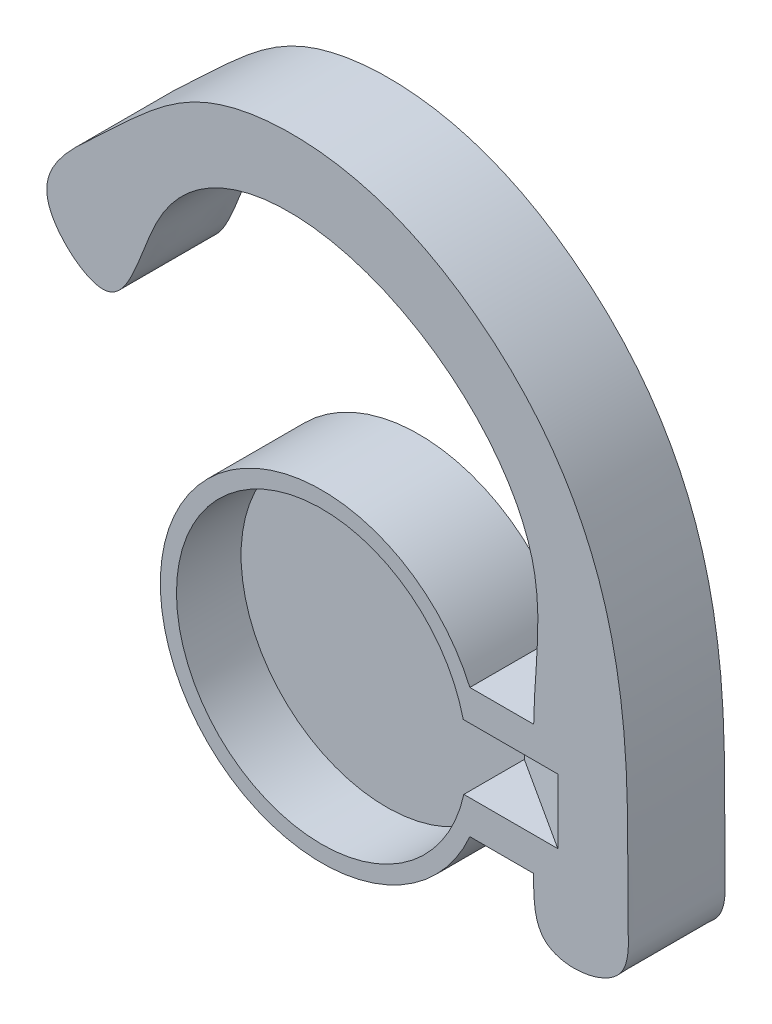
ISO-10303-21;
HEADER;
FILE_DESCRIPTION(('STEP AP214'),'2;1');
FILE_NAME('part.step','',(''),(''),'','','');
FILE_SCHEMA(('AUTOMOTIVE_DESIGN { 1 0 10303 214 1 1 1 1 }'));
ENDSEC;
DATA;
#1=APPLICATION_CONTEXT('core data for automotive mechanical design processes');
#2=APPLICATION_PROTOCOL_DEFINITION('international standard','automotive_design',2000,#1);
#3=PRODUCT_CONTEXT('',#1,'mechanical');
#4=PRODUCT('Part','Part','',(#3));
#5=PRODUCT_RELATED_PRODUCT_CATEGORY('part','',(#4));
#6=PRODUCT_DEFINITION_FORMATION('','',#4);
#7=PRODUCT_DEFINITION_CONTEXT('part definition',#1,'design');
#8=PRODUCT_DEFINITION('design','',#6,#7);
#9=PRODUCT_DEFINITION_SHAPE('','',#8);
#10=(LENGTH_UNIT() NAMED_UNIT(*) SI_UNIT(.MILLI.,.METRE.));
#11=(NAMED_UNIT(*) PLANE_ANGLE_UNIT() SI_UNIT($,.RADIAN.));
#12=(NAMED_UNIT(*) SI_UNIT($,.STERADIAN.) SOLID_ANGLE_UNIT());
#13=UNCERTAINTY_MEASURE_WITH_UNIT(LENGTH_MEASURE(1.E-05),#10,'distance_accuracy_value','');
#14=(GEOMETRIC_REPRESENTATION_CONTEXT(3) GLOBAL_UNCERTAINTY_ASSIGNED_CONTEXT((#13)) GLOBAL_UNIT_ASSIGNED_CONTEXT((#10,
#11,#12)) REPRESENTATION_CONTEXT('',''));
#15=CARTESIAN_POINT('',(0.,0.,0.));
#16=DIRECTION('',(0.,0.,1.));
#17=DIRECTION('',(1.,0.,0.));
#18=AXIS2_PLACEMENT_3D('',#15,#16,#17);
#19=CARTESIAN_POINT('',(0.,0.,9.525));
#20=DIRECTION('',(0.,0.,-1.));
#21=DIRECTION('',(-1.,0.,0.));
#22=AXIS2_PLACEMENT_3D('',#19,#20,#21);
#23=CYLINDRICAL_SURFACE('',#22,15.875);
#24=CARTESIAN_POINT('',(0.,0.,0.));
#25=DIRECTION('',(0.,0.,1.));
#26=DIRECTION('',(1.,0.,0.));
#27=AXIS2_PLACEMENT_3D('',#24,#25,#26);
#28=CIRCLE('',#27,15.875);
#29=CARTESIAN_POINT('',(14.5496777974352,6.35000007801745,0.));
#30=VERTEX_POINT('',#29);
#31=CARTESIAN_POINT('',(14.5496778314848,-6.35,0.));
#32=VERTEX_POINT('',#31);
#33=EDGE_CURVE('E132',#30,#32,#28,.T.);
#34=ORIENTED_EDGE('',*,*,#33,.T.);
#35=DIRECTION('',(0.,0.,-1.));
#36=VECTOR('',#35,1.);
#37=CARTESIAN_POINT('',(14.5496778314848,-6.35,9.525));
#38=LINE('',#37,#36);
#39=CARTESIAN_POINT('',(14.5496778314848,-6.35,9.525));
#40=VERTEX_POINT('',#39);
#41=EDGE_CURVE('E11',#40,#32,#38,.T.);
#42=ORIENTED_EDGE('',*,*,#41,.F.);
#43=CARTESIAN_POINT('',(0.,0.,9.525));
#44=DIRECTION('',(0.,0.,1.));
#45=DIRECTION('',(1.,0.,0.));
#46=AXIS2_PLACEMENT_3D('',#43,#44,#45);
#47=CIRCLE('',#46,15.875);
#48=CARTESIAN_POINT('',(14.5496777974352,6.35000007801745,9.525));
#49=VERTEX_POINT('',#48);
#50=EDGE_CURVE('E134',#49,#40,#47,.T.);
#51=ORIENTED_EDGE('',*,*,#50,.F.);
#52=DIRECTION('',(0.,0.,-1.));
#53=VECTOR('',#52,1.);
#54=CARTESIAN_POINT('',(14.5496777974352,6.35000007801745,9.525));
#55=LINE('',#54,#53);
#56=EDGE_CURVE('E180',#49,#30,#55,.T.);
#57=ORIENTED_EDGE('',*,*,#56,.T.);
#58=EDGE_LOOP('',(#34,#42,#51,#57));
#59=FACE_BOUND('',#58,.T.);
#60=ADVANCED_FACE('F37',(#59),#23,.T.);
#61=CARTESIAN_POINT('',(14.5496778314848,-6.35,9.525));
#62=DIRECTION('',(1.82651203069688E-08,1.,0.));
#63=DIRECTION('',(-1.,1.82651203069688E-08,0.));
#64=AXIS2_PLACEMENT_3D('',#61,#62,#63);
#65=PLANE('',#64);
#66=DIRECTION('',(1.,-1.82651203069688E-08,0.));
#67=VECTOR('',#66,1.);
#68=CARTESIAN_POINT('',(14.5496778314848,-6.35,0.));
#69=LINE('',#68,#67);
#70=CARTESIAN_POINT('',(20.8252672601889,-6.3500001146244,0.));
#71=VERTEX_POINT('',#70);
#72=EDGE_CURVE('E159',#32,#71,#69,.T.);
#73=ORIENTED_EDGE('',*,*,#72,.T.);
#74=DIRECTION('',(0.,0.,-1.));
#75=VECTOR('',#74,1.);
#76=CARTESIAN_POINT('',(20.8252672601889,-6.3500001146244,9.525));
#77=LINE('',#76,#75);
#78=CARTESIAN_POINT('',(20.8252672601889,-6.3500001146244,9.525));
#79=VERTEX_POINT('',#78);
#80=EDGE_CURVE('E44',#79,#71,#77,.T.);
#81=ORIENTED_EDGE('',*,*,#80,.F.);
#82=DIRECTION('',(1.,-1.82651203069688E-08,0.));
#83=VECTOR('',#82,1.);
#84=CARTESIAN_POINT('',(14.5496778314848,-6.35,9.525));
#85=LINE('',#84,#83);
#86=EDGE_CURVE('E88',#40,#79,#85,.T.);
#87=ORIENTED_EDGE('',*,*,#86,.F.);
#88=ORIENTED_EDGE('',*,*,#41,.T.);
#89=EDGE_LOOP('',(#73,#81,#87,#88));
#90=FACE_BOUND('',#89,.T.);
#91=ADVANCED_FACE('F151',(#90),#65,.F.);
#92=CARTESIAN_POINT('',(20.8252672601889,-6.3500001146244,9.525));
#93=CARTESIAN_POINT('',(20.8218096501515,-8.1500150256718,9.525));
#94=CARTESIAN_POINT('',(20.6571149546446,-13.5416465335701,9.525));
#95=CARTESIAN_POINT('',(30.2820957713222,-12.1695925363506,9.525));
#96=CARTESIAN_POINT('',(29.9787665848164,-1.84352185244508,9.525));
#97=CARTESIAN_POINT('',(30.3548099294655,8.82115813712111,9.525));
#98=CARTESIAN_POINT('',(27.8079479066088,22.0641198854274,9.525));
#99=CARTESIAN_POINT('',(22.5118640480456,31.7132442761303,9.525));
#100=CARTESIAN_POINT('',(14.4309786199513,39.5960291805812,9.525));
#101=CARTESIAN_POINT('',(2.99183615262559,45.3612119183042,9.525));
#102=CARTESIAN_POINT('',(-12.3444405770418,44.6869294601875,9.525));
#103=CARTESIAN_POINT('',(-20.4329627282255,36.245863254555,9.525));
#104=CARTESIAN_POINT('',(-29.9944859570205,27.9195340342829,9.525));
#105=CARTESIAN_POINT('',(-19.351650649417,18.6424238795043,9.525));
#106=CARTESIAN_POINT('',(-16.7780585112991,34.7488491253112,9.525));
#107=CARTESIAN_POINT('',(2.09167397667471,41.9581012183719,9.525));
#108=CARTESIAN_POINT('',(23.7372236618389,25.6450936404539,9.525));
#109=CARTESIAN_POINT('',(20.849363884201,10.8011226887338,9.525));
#110=CARTESIAN_POINT('',(20.8252672353104,6.3499998853756,9.525));
#111=B_SPLINE_CURVE_WITH_KNOTS('',3,(#92,#93,#94,#95,#96,#97,#98,#99,#100,#101,#102,#103,#104,
#105,#106,#107,#108,#109,#110),.UNSPECIFIED.,.F.,.F.,(4,1,1,1,1,1,1,1,1,1,1,1,1,1,1,1,4),
(0.00276633426335205,0.028564092455605,0.0648851599990879,0.0857774070148645,0.166122121346859,
0.22904775412342,0.277987557293256,0.32503398004143,0.39195521596406,0.462062413591302,
0.526993765125962,0.572053396376343,0.607175449943813,0.657261386773889,0.7298763229394,
0.875834549358756,0.940871873215341),.UNSPECIFIED.);
#112=DIRECTION('',(0.,0.,-1.));
#113=VECTOR('',#112,1.);
#114=SURFACE_OF_LINEAR_EXTRUSION('',#111,#113);
#115=CARTESIAN_POINT('',(20.8252672601889,-6.3500001146244,0.));
#116=CARTESIAN_POINT('',(20.8218096501515,-8.1500150256718,0.));
#117=CARTESIAN_POINT('',(20.6571149546446,-13.5416465335701,0.));
#118=CARTESIAN_POINT('',(30.2820957713222,-12.1695925363506,0.));
#119=CARTESIAN_POINT('',(29.9787665848164,-1.84352185244508,0.));
#120=CARTESIAN_POINT('',(30.3548099294655,8.82115813712111,0.));
#121=CARTESIAN_POINT('',(27.8079479066088,22.0641198854274,0.));
#122=CARTESIAN_POINT('',(22.5118640480456,31.7132442761303,0.));
#123=CARTESIAN_POINT('',(14.4309786199513,39.5960291805812,0.));
#124=CARTESIAN_POINT('',(2.99183615262559,45.3612119183042,0.));
#125=CARTESIAN_POINT('',(-12.3444405770418,44.6869294601875,0.));
#126=CARTESIAN_POINT('',(-20.4329627282255,36.245863254555,0.));
#127=CARTESIAN_POINT('',(-29.9944859570205,27.9195340342829,0.));
#128=CARTESIAN_POINT('',(-19.351650649417,18.6424238795043,0.));
#129=CARTESIAN_POINT('',(-16.7780585112991,34.7488491253112,0.));
#130=CARTESIAN_POINT('',(2.09167397667471,41.9581012183719,0.));
#131=CARTESIAN_POINT('',(23.7372236618389,25.6450936404539,0.));
#132=CARTESIAN_POINT('',(20.849363884201,10.8011226887338,0.));
#133=CARTESIAN_POINT('',(20.8252672353104,6.3499998853756,0.));
#134=B_SPLINE_CURVE_WITH_KNOTS('',3,(#115,#116,#117,#118,#119,#120,#121,#122,#123,#124,#125,
#126,#127,#128,#129,#130,#131,#132,#133),.UNSPECIFIED.,.F.,.F.,(4,1,1,1,1,1,1,1,1,1,1,1,1,1,1,1,
4),(0.00276633426335205,0.028564092455605,0.0648851599990879,0.0857774070148645,
0.166122121346859,0.22904775412342,0.277987557293256,0.32503398004143,0.39195521596406,
0.462062413591302,0.526993765125962,0.572053396376343,0.607175449943813,0.657261386773889,
0.7298763229394,0.875834549358756,0.940871873215341),.UNSPECIFIED.);
#135=CARTESIAN_POINT('',(20.8252672353104,6.3499998853756,0.));
#136=VERTEX_POINT('',#135);
#137=EDGE_CURVE('E167',#71,#136,#134,.T.);
#138=ORIENTED_EDGE('',*,*,#137,.T.);
#139=DIRECTION('',(0.,0.,-1.));
#140=VECTOR('',#139,1.);
#141=CARTESIAN_POINT('',(20.8252672353104,6.3499998853756,9.525));
#142=LINE('',#141,#140);
#143=CARTESIAN_POINT('',(20.8252672353104,6.3499998853756,9.525));
#144=VERTEX_POINT('',#143);
#145=EDGE_CURVE('E170',#144,#136,#142,.T.);
#146=ORIENTED_EDGE('',*,*,#145,.F.);
#147=EDGE_CURVE('E137',#79,#144,#111,.T.);
#148=ORIENTED_EDGE('',*,*,#147,.F.);
#149=ORIENTED_EDGE('',*,*,#80,.T.);
#150=EDGE_LOOP('',(#138,#146,#148,#149));
#151=FACE_BOUND('',#150,.T.);
#152=ADVANCED_FACE('F147',(#151),#114,.F.);
#153=CARTESIAN_POINT('',(14.5496777974352,6.35000007801745,9.525));
#154=DIRECTION('',(-3.06970118674135E-08,-1.,0.));
#155=DIRECTION('',(1.,-3.06970118674135E-08,0.));
#156=AXIS2_PLACEMENT_3D('',#153,#154,#155);
#157=PLANE('',#156);
#158=DIRECTION('',(-1.,3.06970118674135E-08,0.));
#159=VECTOR('',#158,1.);
#160=CARTESIAN_POINT('',(14.5496777974352,6.35000007801745,0.));
#161=LINE('',#160,#159);
#162=EDGE_CURVE('E81',#136,#30,#161,.T.);
#163=ORIENTED_EDGE('',*,*,#162,.T.);
#164=ORIENTED_EDGE('',*,*,#56,.F.);
#165=DIRECTION('',(-1.,3.06970118674135E-08,0.));
#166=VECTOR('',#165,1.);
#167=CARTESIAN_POINT('',(14.5496777974352,6.35000007801745,9.525));
#168=LINE('',#167,#166);
#169=EDGE_CURVE('E60',#144,#49,#168,.T.);
#170=ORIENTED_EDGE('',*,*,#169,.F.);
#171=ORIENTED_EDGE('',*,*,#145,.T.);
#172=EDGE_LOOP('',(#163,#164,#170,#171));
#173=FACE_BOUND('',#172,.T.);
#174=ADVANCED_FACE('F150',(#173),#157,.F.);
#175=CARTESIAN_POINT('',(0.,0.,9.525));
#176=DIRECTION('',(0.,0.,1.));
#177=DIRECTION('',(1.,0.,0.));
#178=AXIS2_PLACEMENT_3D('',#175,#176,#177);
#179=PLANE('',#178);
#180=DIRECTION('',(-1.,1.82651202959028E-08,0.));
#181=VECTOR('',#180,1.);
#182=CARTESIAN_POINT('',(6.03114320710562E-08,3.30200026575161,9.525));
#183=LINE('',#182,#181);
#184=CARTESIAN_POINT('',(23.1933533203821,3.30199984212222,9.525));
#185=VERTEX_POINT('',#184);
#186=CARTESIAN_POINT('',(13.9006997007963,3.30200001185366,9.525));
#187=VERTEX_POINT('',#186);
#188=EDGE_CURVE('E123',#185,#187,#183,.T.);
#189=ORIENTED_EDGE('',*,*,#188,.F.);
#190=DIRECTION('',(1.82651203069688E-08,1.,0.));
#191=VECTOR('',#190,1.);
#192=CARTESIAN_POINT('',(23.1933532600706,-4.23629387617216E-07,9.525));
#193=LINE('',#192,#191);
#194=CARTESIAN_POINT('',(23.1933532043985,-3.04800015787777,9.525));
#195=VERTEX_POINT('',#194);
#196=EDGE_CURVE('E115',#195,#185,#193,.T.);
#197=ORIENTED_EDGE('',*,*,#196,.F.);
#198=DIRECTION('',(-1.,1.82651202959028E-08,0.));
#199=VECTOR('',#198,1.);
#200=CARTESIAN_POINT('',(-5.56720818079266E-08,-3.04799973424839,9.525));
#201=LINE('',#200,#199);
#202=CARTESIAN_POINT('',(13.9585942098699,-3.04799998920379,9.525));
#203=VERTEX_POINT('',#202);
#204=EDGE_CURVE('E102',#195,#203,#201,.T.);
#205=ORIENTED_EDGE('',*,*,#204,.T.);
#206=CARTESIAN_POINT('',(0.,0.,9.525));
#207=DIRECTION('',(0.,0.,1.));
#208=DIRECTION('',(1.,0.,0.));
#209=AXIS2_PLACEMENT_3D('',#206,#207,#208);
#210=CIRCLE('',#209,14.2875);
#211=EDGE_CURVE('E124',#187,#203,#210,.T.);
#212=ORIENTED_EDGE('',*,*,#211,.F.);
#213=EDGE_LOOP('',(#189,#197,#205,#212));
#214=FACE_BOUND('',#213,.T.);
#215=ORIENTED_EDGE('',*,*,#50,.T.);
#216=ORIENTED_EDGE('',*,*,#86,.T.);
#217=ORIENTED_EDGE('',*,*,#147,.T.);
#218=ORIENTED_EDGE('',*,*,#169,.T.);
#219=EDGE_LOOP('',(#215,#216,#217,#218));
#220=FACE_BOUND('',#219,.T.);
#221=ADVANCED_FACE('F122',(#214,#220),#179,.T.);
#222=CARTESIAN_POINT('',(0.,0.,0.));
#223=DIRECTION('',(0.,0.,1.));
#224=DIRECTION('',(1.,0.,0.));
#225=AXIS2_PLACEMENT_3D('',#222,#223,#224);
#226=PLANE('',#225);
#227=ORIENTED_EDGE('',*,*,#33,.F.);
#228=ORIENTED_EDGE('',*,*,#162,.F.);
#229=ORIENTED_EDGE('',*,*,#137,.F.);
#230=ORIENTED_EDGE('',*,*,#72,.F.);
#231=EDGE_LOOP('',(#227,#228,#229,#230));
#232=FACE_BOUND('',#231,.T.);
#233=ADVANCED_FACE('F171',(#232),#226,.F.);
#234=CARTESIAN_POINT('',(0.,0.,3.175));
#235=DIRECTION('',(0.,0.,1.));
#236=DIRECTION('',(1.,0.,0.));
#237=AXIS2_PLACEMENT_3D('',#234,#235,#236);
#238=CYLINDRICAL_SURFACE('',#237,14.2875);
#239=CARTESIAN_POINT('',(0.,0.,3.175));
#240=DIRECTION('',(0.,0.,1.));
#241=DIRECTION('',(1.,0.,0.));
#242=AXIS2_PLACEMENT_3D('',#239,#240,#241);
#243=CIRCLE('',#242,14.2875);
#244=CARTESIAN_POINT('',(14.2875,0.,3.175));
#245=VERTEX_POINT('',#244);
#246=EDGE_CURVE('E126',#245,#245,#243,.T.);
#247=ORIENTED_EDGE('',*,*,#246,.F.);
#248=EDGE_LOOP('',(#247));
#249=FACE_BOUND('',#248,.T.);
#250=CARTESIAN_POINT('',(0.,0.,-5.42088295869092));
#251=DIRECTION('',(0.541677142120772,-9.89379816837092E-09,-0.84058662474719));
#252=DIRECTION('',(0.84058662474719,-1.53534158294362E-08,0.541677142120772));
#253=AXIS2_PLACEMENT_3D('',#250,#251,#252);
#254=ELLIPSE('',#253,16.9970584581893,14.2875);
#255=CARTESIAN_POINT('',(13.9585942098699,-3.04799998920379,3.5740870148751));
#256=VERTEX_POINT('',#255);
#257=CARTESIAN_POINT('',(13.9006997007963,3.30200001185366,3.53677950352311));
#258=VERTEX_POINT('',#257);
#259=EDGE_CURVE('E118',#256,#258,#254,.F.);
#260=ORIENTED_EDGE('',*,*,#259,.T.);
#261=DIRECTION('',(0.,0.,1.));
#262=VECTOR('',#261,1.);
#263=CARTESIAN_POINT('',(13.9006997007963,3.30200001185366,3.175));
#264=LINE('',#263,#262);
#265=EDGE_CURVE('E110',#258,#187,#264,.T.);
#266=ORIENTED_EDGE('',*,*,#265,.T.);
#267=ORIENTED_EDGE('',*,*,#211,.T.);
#268=DIRECTION('',(0.,0.,1.));
#269=VECTOR('',#268,1.);
#270=CARTESIAN_POINT('',(13.9585942098699,-3.04799998920379,3.175));
#271=LINE('',#270,#269);
#272=EDGE_CURVE('E105',#256,#203,#271,.T.);
#273=ORIENTED_EDGE('',*,*,#272,.F.);
#274=EDGE_LOOP('',(#260,#266,#267,#273));
#275=FACE_BOUND('',#274,.T.);
#276=ADVANCED_FACE('F189',(#249,#275),#238,.F.);
#277=CARTESIAN_POINT('',(0.,0.,3.175));
#278=DIRECTION('',(0.,0.,1.));
#279=DIRECTION('',(1.,0.,0.));
#280=AXIS2_PLACEMENT_3D('',#277,#278,#279);
#281=PLANE('',#280);
#282=ORIENTED_EDGE('',*,*,#246,.T.);
#283=EDGE_LOOP('',(#282));
#284=FACE_BOUND('',#283,.T.);
#285=ADVANCED_FACE('F193',(#284),#281,.T.);
#286=CARTESIAN_POINT('',(13.3392822287971,3.30200002210802,3.175));
#287=DIRECTION('',(0.541677142120772,-9.89379816837092E-09,-0.84058662474719));
#288=DIRECTION('',(-0.84058662474719,0.,-0.541677142120772));
#289=AXIS2_PLACEMENT_3D('',#286,#287,#288);
#290=PLANE('',#289);
#291=ORIENTED_EDGE('',*,*,#196,.T.);
#292=DIRECTION('',(0.84058662474719,-1.53534158201343E-08,0.541677142120772));
#293=VECTOR('',#292,1.);
#294=CARTESIAN_POINT('',(13.3392822287971,3.30200002210802,3.175));
#295=LINE('',#294,#293);
#296=EDGE_CURVE('E119',#258,#185,#295,.T.);
#297=ORIENTED_EDGE('',*,*,#296,.F.);
#298=ORIENTED_EDGE('',*,*,#259,.F.);
#299=DIRECTION('',(0.84058662474719,-1.53534158201343E-08,0.541677142120772));
#300=VECTOR('',#299,1.);
#301=CARTESIAN_POINT('',(13.3392821128136,-3.04799997789198,3.175));
#302=LINE('',#301,#300);
#303=EDGE_CURVE('E51',#256,#195,#302,.T.);
#304=ORIENTED_EDGE('',*,*,#303,.T.);
#305=EDGE_LOOP('',(#291,#297,#298,#304));
#306=FACE_BOUND('',#305,.T.);
#307=ADVANCED_FACE('F113',(#306),#290,.F.);
#308=CARTESIAN_POINT('',(6.0311432177865E-08,3.30200026575161,0.));
#309=DIRECTION('',(1.82651202959028E-08,1.,0.));
#310=DIRECTION('',(-1.,1.82651202959028E-08,0.));
#311=AXIS2_PLACEMENT_3D('',#308,#309,#310);
#312=PLANE('',#311);
#313=ORIENTED_EDGE('',*,*,#188,.T.);
#314=ORIENTED_EDGE('',*,*,#265,.F.);
#315=ORIENTED_EDGE('',*,*,#296,.T.);
#316=EDGE_LOOP('',(#313,#314,#315));
#317=FACE_BOUND('',#316,.T.);
#318=ADVANCED_FACE('F200',(#317),#312,.F.);
#319=CARTESIAN_POINT('',(-5.56720817713867E-08,-3.04799973424839,0.));
#320=DIRECTION('',(1.82651202959028E-08,1.,0.));
#321=DIRECTION('',(-1.,1.82651202959028E-08,0.));
#322=AXIS2_PLACEMENT_3D('',#319,#320,#321);
#323=PLANE('',#322);
#324=ORIENTED_EDGE('',*,*,#303,.F.);
#325=ORIENTED_EDGE('',*,*,#272,.T.);
#326=ORIENTED_EDGE('',*,*,#204,.F.);
#327=EDGE_LOOP('',(#324,#325,#326));
#328=FACE_BOUND('',#327,.T.);
#329=ADVANCED_FACE('F103',(#328),#323,.T.);
#330=CLOSED_SHELL('',(#60,#91,#152,#174,#221,#233,#276,#285,#307,#318,#329));
#331=MANIFOLD_SOLID_BREP('B2',#330);
#332=ADVANCED_BREP_SHAPE_REPRESENTATION('',(#18,#331),#14);
#333=SHAPE_DEFINITION_REPRESENTATION(#9,#332);
ENDSEC;
END-ISO-10303-21;
